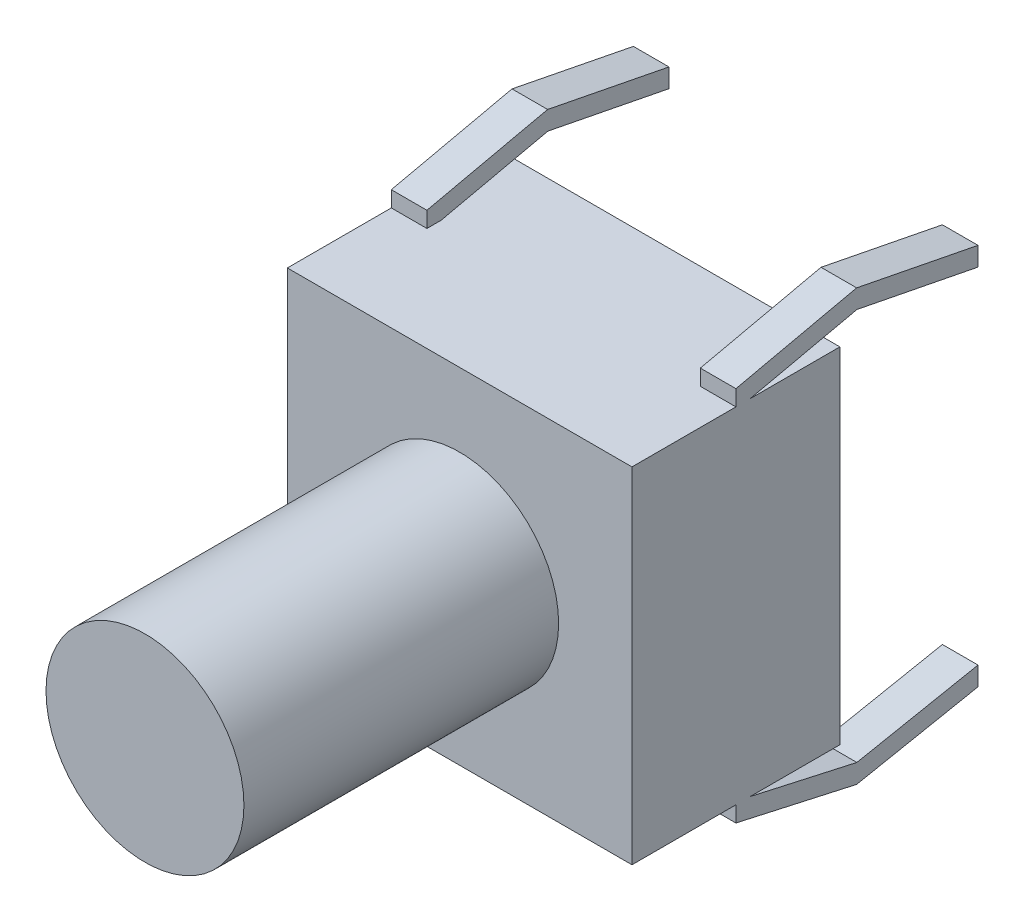
ISO-10303-21;
HEADER;
FILE_DESCRIPTION(('STEP AP214'),'2;1');
FILE_NAME('part.step','',(''),(''),'','','');
FILE_SCHEMA(('AUTOMOTIVE_DESIGN { 1 0 10303 214 1 1 1 1 }'));
ENDSEC;
DATA;
#1=APPLICATION_CONTEXT('core data for automotive mechanical design processes');
#2=APPLICATION_PROTOCOL_DEFINITION('international standard','automotive_design',2000,#1);
#3=PRODUCT_CONTEXT('',#1,'mechanical');
#4=PRODUCT('Part','Part','',(#3));
#5=PRODUCT_RELATED_PRODUCT_CATEGORY('part','',(#4));
#6=PRODUCT_DEFINITION_FORMATION('','',#4);
#7=PRODUCT_DEFINITION_CONTEXT('part definition',#1,'design');
#8=PRODUCT_DEFINITION('design','',#6,#7);
#9=PRODUCT_DEFINITION_SHAPE('','',#8);
#10=(LENGTH_UNIT() NAMED_UNIT(*) SI_UNIT(.MILLI.,.METRE.));
#11=(NAMED_UNIT(*) PLANE_ANGLE_UNIT() SI_UNIT($,.RADIAN.));
#12=(NAMED_UNIT(*) SI_UNIT($,.STERADIAN.) SOLID_ANGLE_UNIT());
#13=UNCERTAINTY_MEASURE_WITH_UNIT(LENGTH_MEASURE(1.E-05),#10,'distance_accuracy_value','');
#14=(GEOMETRIC_REPRESENTATION_CONTEXT(3) GLOBAL_UNCERTAINTY_ASSIGNED_CONTEXT((#13)) GLOBAL_UNIT_ASSIGNED_CONTEXT((#10,
#11,#12)) REPRESENTATION_CONTEXT('',''));
#15=CARTESIAN_POINT('',(0.,0.,0.));
#16=DIRECTION('',(0.,0.,1.));
#17=DIRECTION('',(1.,0.,0.));
#18=AXIS2_PLACEMENT_3D('',#15,#16,#17);
#19=CARTESIAN_POINT('',(-3.07339999999999,-3.0734,3.7084));
#20=DIRECTION('',(0.,1.,0.));
#21=DIRECTION('',(0.,0.,1.));
#22=AXIS2_PLACEMENT_3D('',#19,#20,#21);
#23=PLANE('',#22);
#24=DIRECTION('',(-1.,0.,0.));
#25=VECTOR('',#24,1.);
#26=CARTESIAN_POINT('',(-2.43839999999999,-3.0734,1.8542));
#27=LINE('',#26,#25);
#28=CARTESIAN_POINT('',(-2.43839999999999,-3.0734,1.8542));
#29=VERTEX_POINT('',#28);
#30=CARTESIAN_POINT('',(-3.07339999999999,-3.0734,1.8542));
#31=VERTEX_POINT('',#30);
#32=EDGE_CURVE('E58',#29,#31,#27,.T.);
#33=ORIENTED_EDGE('',*,*,#32,.F.);
#34=DIRECTION('',(0.,0.,1.));
#35=VECTOR('',#34,1.);
#36=CARTESIAN_POINT('',(-2.43839999999999,-3.0734,1.6002));
#37=LINE('',#36,#35);
#38=CARTESIAN_POINT('',(-2.43839999999999,-3.0734,1.6002));
#39=VERTEX_POINT('',#38);
#40=EDGE_CURVE('E63',#39,#29,#37,.T.);
#41=ORIENTED_EDGE('',*,*,#40,.F.);
#42=DIRECTION('',(-1.,0.,0.));
#43=VECTOR('',#42,1.);
#44=CARTESIAN_POINT('',(-2.43839999999999,-3.0734,1.6002));
#45=LINE('',#44,#43);
#46=CARTESIAN_POINT('',(-3.07339999999999,-3.0734,1.6002));
#47=VERTEX_POINT('',#46);
#48=EDGE_CURVE('E274',#39,#47,#45,.T.);
#49=ORIENTED_EDGE('',*,*,#48,.T.);
#50=DIRECTION('',(0.,0.,-1.));
#51=VECTOR('',#50,1.);
#52=CARTESIAN_POINT('',(-3.07339999999999,-3.0734,3.7084));
#53=LINE('',#52,#51);
#54=CARTESIAN_POINT('',(-3.07339999999999,-3.0734,0.));
#55=VERTEX_POINT('',#54);
#56=EDGE_CURVE('E584',#47,#55,#53,.T.);
#57=ORIENTED_EDGE('',*,*,#56,.T.);
#58=DIRECTION('',(1.,0.,0.));
#59=VECTOR('',#58,1.);
#60=CARTESIAN_POINT('',(-3.07339999999999,-3.0734,0.));
#61=LINE('',#60,#59);
#62=CARTESIAN_POINT('',(3.07340000000001,-3.0734,0.));
#63=VERTEX_POINT('',#62);
#64=EDGE_CURVE('E556',#55,#63,#61,.T.);
#65=ORIENTED_EDGE('',*,*,#64,.T.);
#66=DIRECTION('',(0.,0.,-1.));
#67=VECTOR('',#66,1.);
#68=CARTESIAN_POINT('',(3.07340000000001,-3.0734,3.7084));
#69=LINE('',#68,#67);
#70=CARTESIAN_POINT('',(3.07340000000001,-3.0734,1.6002));
#71=VERTEX_POINT('',#70);
#72=EDGE_CURVE('E565',#71,#63,#69,.T.);
#73=ORIENTED_EDGE('',*,*,#72,.F.);
#74=DIRECTION('',(1.,0.,0.));
#75=VECTOR('',#74,1.);
#76=CARTESIAN_POINT('',(2.43839999999999,-3.0734,1.6002));
#77=LINE('',#76,#75);
#78=CARTESIAN_POINT('',(2.43839999999999,-3.0734,1.6002));
#79=VERTEX_POINT('',#78);
#80=EDGE_CURVE('E380',#79,#71,#77,.T.);
#81=ORIENTED_EDGE('',*,*,#80,.F.);
#82=DIRECTION('',(0.,0.,1.));
#83=VECTOR('',#82,1.);
#84=CARTESIAN_POINT('',(2.43839999999999,-3.0734,1.6002));
#85=LINE('',#84,#83);
#86=CARTESIAN_POINT('',(2.43839999999999,-3.0734,1.8542));
#87=VERTEX_POINT('',#86);
#88=EDGE_CURVE('E329',#79,#87,#85,.T.);
#89=ORIENTED_EDGE('',*,*,#88,.T.);
#90=DIRECTION('',(1.,0.,0.));
#91=VECTOR('',#90,1.);
#92=CARTESIAN_POINT('',(2.43839999999999,-3.0734,1.8542));
#93=LINE('',#92,#91);
#94=CARTESIAN_POINT('',(3.07339999999999,-3.0734,1.8542));
#95=VERTEX_POINT('',#94);
#96=EDGE_CURVE('E358',#87,#95,#93,.T.);
#97=ORIENTED_EDGE('',*,*,#96,.T.);
#98=CARTESIAN_POINT('',(3.07340000000001,-3.0734,3.7084));
#99=VERTEX_POINT('',#98);
#100=EDGE_CURVE('E580',#99,#95,#69,.T.);
#101=ORIENTED_EDGE('',*,*,#100,.F.);
#102=DIRECTION('',(1.,0.,0.));
#103=VECTOR('',#102,1.);
#104=CARTESIAN_POINT('',(-3.07339999999999,-3.0734,3.7084));
#105=LINE('',#104,#103);
#106=CARTESIAN_POINT('',(-3.07339999999999,-3.0734,3.7084));
#107=VERTEX_POINT('',#106);
#108=EDGE_CURVE('E562',#107,#99,#105,.T.);
#109=ORIENTED_EDGE('',*,*,#108,.F.);
#110=EDGE_CURVE('E585',#107,#31,#53,.T.);
#111=ORIENTED_EDGE('',*,*,#110,.T.);
#112=EDGE_LOOP('',(#33,#41,#49,#57,#65,#73,#81,#89,#97,#101,#109,#111));
#113=FACE_BOUND('',#112,.T.);
#114=ADVANCED_FACE('F41',(#113),#23,.F.);
#115=CARTESIAN_POINT('',(-3.07339999999999,3.0734,3.7084));
#116=DIRECTION('',(0.,-1.,0.));
#117=DIRECTION('',(0.,0.,-1.));
#118=AXIS2_PLACEMENT_3D('',#115,#116,#117);
#119=PLANE('',#118);
#120=DIRECTION('',(1.,0.,0.));
#121=VECTOR('',#120,1.);
#122=CARTESIAN_POINT('',(2.43839999999999,3.0734,1.8542));
#123=LINE('',#122,#121);
#124=CARTESIAN_POINT('',(2.43839999999999,3.0734,1.8542));
#125=VERTEX_POINT('',#124);
#126=CARTESIAN_POINT('',(3.07340000000001,3.0734,1.8542));
#127=VERTEX_POINT('',#126);
#128=EDGE_CURVE('E445',#125,#127,#123,.T.);
#129=ORIENTED_EDGE('',*,*,#128,.F.);
#130=DIRECTION('',(0.,0.,1.));
#131=VECTOR('',#130,1.);
#132=CARTESIAN_POINT('',(2.43839999999999,3.0734,1.6002));
#133=LINE('',#132,#131);
#134=CARTESIAN_POINT('',(2.43839999999999,3.0734,1.6002));
#135=VERTEX_POINT('',#134);
#136=EDGE_CURVE('E403',#135,#125,#133,.T.);
#137=ORIENTED_EDGE('',*,*,#136,.F.);
#138=DIRECTION('',(1.,0.,0.));
#139=VECTOR('',#138,1.);
#140=CARTESIAN_POINT('',(2.43839999999999,3.0734,1.6002));
#141=LINE('',#140,#139);
#142=CARTESIAN_POINT('',(3.07339999999999,3.0734,1.6002));
#143=VERTEX_POINT('',#142);
#144=EDGE_CURVE('E427',#135,#143,#141,.T.);
#145=ORIENTED_EDGE('',*,*,#144,.T.);
#146=DIRECTION('',(0.,0.,-1.));
#147=VECTOR('',#146,1.);
#148=CARTESIAN_POINT('',(3.07340000000001,3.0734,3.7084));
#149=LINE('',#148,#147);
#150=CARTESIAN_POINT('',(3.07340000000001,3.0734,0.));
#151=VERTEX_POINT('',#150);
#152=EDGE_CURVE('E591',#143,#151,#149,.T.);
#153=ORIENTED_EDGE('',*,*,#152,.T.);
#154=DIRECTION('',(-1.,0.,0.));
#155=VECTOR('',#154,1.);
#156=CARTESIAN_POINT('',(-3.07339999999999,3.0734,0.));
#157=LINE('',#156,#155);
#158=CARTESIAN_POINT('',(-3.07339999999999,3.0734,0.));
#159=VERTEX_POINT('',#158);
#160=EDGE_CURVE('E569',#151,#159,#157,.T.);
#161=ORIENTED_EDGE('',*,*,#160,.T.);
#162=DIRECTION('',(0.,0.,-1.));
#163=VECTOR('',#162,1.);
#164=CARTESIAN_POINT('',(-3.07339999999999,3.0734,3.7084));
#165=LINE('',#164,#163);
#166=CARTESIAN_POINT('',(-3.07339999999999,3.0734,1.6002));
#167=VERTEX_POINT('',#166);
#168=EDGE_CURVE('E587',#167,#159,#165,.T.);
#169=ORIENTED_EDGE('',*,*,#168,.F.);
#170=DIRECTION('',(-1.,0.,0.));
#171=VECTOR('',#170,1.);
#172=CARTESIAN_POINT('',(-2.43839999999999,3.0734,1.6002));
#173=LINE('',#172,#171);
#174=CARTESIAN_POINT('',(-2.43839999999999,3.0734,1.6002));
#175=VERTEX_POINT('',#174);
#176=EDGE_CURVE('E524',#175,#167,#173,.T.);
#177=ORIENTED_EDGE('',*,*,#176,.F.);
#178=DIRECTION('',(0.,0.,1.));
#179=VECTOR('',#178,1.);
#180=CARTESIAN_POINT('',(-2.43839999999999,3.0734,1.6002));
#181=LINE('',#180,#179);
#182=CARTESIAN_POINT('',(-2.43839999999999,3.0734,1.8542));
#183=VERTEX_POINT('',#182);
#184=EDGE_CURVE('E473',#175,#183,#181,.T.);
#185=ORIENTED_EDGE('',*,*,#184,.T.);
#186=DIRECTION('',(-1.,0.,0.));
#187=VECTOR('',#186,1.);
#188=CARTESIAN_POINT('',(-2.43839999999999,3.0734,1.8542));
#189=LINE('',#188,#187);
#190=CARTESIAN_POINT('',(-3.07339999999999,3.0734,1.8542));
#191=VERTEX_POINT('',#190);
#192=EDGE_CURVE('E502',#183,#191,#189,.T.);
#193=ORIENTED_EDGE('',*,*,#192,.T.);
#194=CARTESIAN_POINT('',(-3.07339999999999,3.0734,3.7084));
#195=VERTEX_POINT('',#194);
#196=EDGE_CURVE('E588',#195,#191,#165,.T.);
#197=ORIENTED_EDGE('',*,*,#196,.F.);
#198=DIRECTION('',(-1.,0.,0.));
#199=VECTOR('',#198,1.);
#200=CARTESIAN_POINT('',(-3.07339999999999,3.0734,3.7084));
#201=LINE('',#200,#199);
#202=CARTESIAN_POINT('',(3.07340000000001,3.0734,3.7084));
#203=VERTEX_POINT('',#202);
#204=EDGE_CURVE('E555',#203,#195,#201,.T.);
#205=ORIENTED_EDGE('',*,*,#204,.F.);
#206=EDGE_CURVE('E45',#203,#127,#149,.T.);
#207=ORIENTED_EDGE('',*,*,#206,.T.);
#208=EDGE_LOOP('',(#129,#137,#145,#153,#161,#169,#177,#185,#193,#197,#205,#207));
#209=FACE_BOUND('',#208,.T.);
#210=ADVANCED_FACE('F605',(#209),#119,.F.);
#211=CARTESIAN_POINT('',(3.07340000000001,-3.0734,3.7084));
#212=DIRECTION('',(-1.,0.,0.));
#213=DIRECTION('',(0.,0.,1.));
#214=AXIS2_PLACEMENT_3D('',#211,#212,#213);
#215=PLANE('',#214);
#216=DIRECTION('',(0.,1.,0.));
#217=VECTOR('',#216,1.);
#218=CARTESIAN_POINT('',(3.07340000000001,-3.0734,0.));
#219=LINE('',#218,#217);
#220=EDGE_CURVE('E549',#63,#151,#219,.T.);
#221=ORIENTED_EDGE('',*,*,#220,.T.);
#222=ORIENTED_EDGE('',*,*,#152,.F.);
#223=DIRECTION('',(0.,-0.217728161041355,0.976009450717333));
#224=VECTOR('',#223,1.);
#225=CARTESIAN_POINT('',(3.07339999999999,3.49803981995083,-0.303331795982005));
#226=LINE('',#225,#224);
#227=CARTESIAN_POINT('',(3.07339999999999,3.49803981995083,-0.303331795982005));
#228=VERTEX_POINT('',#227);
#229=EDGE_CURVE('E384',#228,#143,#226,.T.);
#230=ORIENTED_EDGE('',*,*,#229,.F.);
#231=DIRECTION('',(0.,0.192859935265024,0.981226296717312));
#232=VECTOR('',#231,1.);
#233=CARTESIAN_POINT('',(3.07339999999999,3.0734,-2.4638));
#234=LINE('',#233,#232);
#235=CARTESIAN_POINT('',(3.07339999999999,3.0734,-2.4638));
#236=VERTEX_POINT('',#235);
#237=EDGE_CURVE('E431',#236,#228,#234,.T.);
#238=ORIENTED_EDGE('',*,*,#237,.F.);
#239=DIRECTION('',(0.,-1.,0.));
#240=VECTOR('',#239,1.);
#241=CARTESIAN_POINT('',(3.07339999999999,3.40991768313251,-2.4638));
#242=LINE('',#241,#240);
#243=CARTESIAN_POINT('',(3.07339999999999,3.40991768313251,-2.4638));
#244=VERTEX_POINT('',#243);
#245=EDGE_CURVE('E434',#244,#236,#242,.T.);
#246=ORIENTED_EDGE('',*,*,#245,.F.);
#247=DIRECTION('',(0.,-0.192859935265024,-0.981226296717312));
#248=VECTOR('',#247,1.);
#249=CARTESIAN_POINT('',(3.07339999999999,3.8354,-0.299045368485264));
#250=LINE('',#249,#248);
#251=CARTESIAN_POINT('',(3.07339999999999,3.8354,-0.299045368485264));
#252=VERTEX_POINT('',#251);
#253=EDGE_CURVE('E437',#252,#244,#250,.T.);
#254=ORIENTED_EDGE('',*,*,#253,.F.);
#255=DIRECTION('',(0.,0.217728161041356,-0.976009450717333));
#256=VECTOR('',#255,1.);
#257=CARTESIAN_POINT('',(3.07339999999999,3.35505408326063,1.8542));
#258=LINE('',#257,#256);
#259=CARTESIAN_POINT('',(3.07339999999999,3.35505408326063,1.8542));
#260=VERTEX_POINT('',#259);
#261=EDGE_CURVE('E440',#260,#252,#258,.T.);
#262=ORIENTED_EDGE('',*,*,#261,.F.);
#263=DIRECTION('',(0.,1.,0.));
#264=VECTOR('',#263,1.);
#265=CARTESIAN_POINT('',(3.07339999999999,3.0734,1.8542));
#266=LINE('',#265,#264);
#267=EDGE_CURVE('E408',#127,#260,#266,.T.);
#268=ORIENTED_EDGE('',*,*,#267,.F.);
#269=ORIENTED_EDGE('',*,*,#206,.F.);
#270=DIRECTION('',(0.,1.,0.));
#271=VECTOR('',#270,1.);
#272=CARTESIAN_POINT('',(3.07340000000001,-3.0734,3.7084));
#273=LINE('',#272,#271);
#274=EDGE_CURVE('E551',#99,#203,#273,.T.);
#275=ORIENTED_EDGE('',*,*,#274,.F.);
#276=ORIENTED_EDGE('',*,*,#100,.T.);
#277=DIRECTION('',(0.,-1.,0.));
#278=VECTOR('',#277,1.);
#279=CARTESIAN_POINT('',(3.07339999999999,-3.0734,1.8542));
#280=LINE('',#279,#278);
#281=CARTESIAN_POINT('',(3.07339999999999,-3.35505408326063,1.8542));
#282=VERTEX_POINT('',#281);
#283=EDGE_CURVE('E312',#95,#282,#280,.T.);
#284=ORIENTED_EDGE('',*,*,#283,.T.);
#285=DIRECTION('',(0.,-0.217728161041356,-0.976009450717333));
#286=VECTOR('',#285,1.);
#287=CARTESIAN_POINT('',(3.07339999999999,-3.35505408326063,1.8542));
#288=LINE('',#287,#286);
#289=CARTESIAN_POINT('',(3.07339999999999,-3.8354,-0.299045368485264));
#290=VERTEX_POINT('',#289);
#291=EDGE_CURVE('E362',#282,#290,#288,.T.);
#292=ORIENTED_EDGE('',*,*,#291,.T.);
#293=DIRECTION('',(0.,0.192859935265024,-0.981226296717312));
#294=VECTOR('',#293,1.);
#295=CARTESIAN_POINT('',(3.07339999999999,-3.8354,-0.299045368485264));
#296=LINE('',#295,#294);
#297=CARTESIAN_POINT('',(3.07339999999999,-3.40991768313251,-2.4638));
#298=VERTEX_POINT('',#297);
#299=EDGE_CURVE('E366',#290,#298,#296,.T.);
#300=ORIENTED_EDGE('',*,*,#299,.T.);
#301=DIRECTION('',(0.,1.,0.));
#302=VECTOR('',#301,1.);
#303=CARTESIAN_POINT('',(3.07339999999999,-3.40991768313251,-2.4638));
#304=LINE('',#303,#302);
#305=CARTESIAN_POINT('',(3.07339999999999,-3.0734,-2.4638));
#306=VERTEX_POINT('',#305);
#307=EDGE_CURVE('E370',#298,#306,#304,.T.);
#308=ORIENTED_EDGE('',*,*,#307,.T.);
#309=DIRECTION('',(0.,-0.192859935265024,0.981226296717312));
#310=VECTOR('',#309,1.);
#311=CARTESIAN_POINT('',(3.07339999999999,-3.0734,-2.4638));
#312=LINE('',#311,#310);
#313=CARTESIAN_POINT('',(3.07339999999999,-3.49803981995083,-0.303331795982005));
#314=VERTEX_POINT('',#313);
#315=EDGE_CURVE('E374',#306,#314,#312,.T.);
#316=ORIENTED_EDGE('',*,*,#315,.T.);
#317=DIRECTION('',(0.,0.217728161041355,0.976009450717333));
#318=VECTOR('',#317,1.);
#319=CARTESIAN_POINT('',(3.07339999999999,-3.49803981995083,-0.303331795982005));
#320=LINE('',#319,#318);
#321=EDGE_CURVE('E334',#314,#71,#320,.T.);
#322=ORIENTED_EDGE('',*,*,#321,.T.);
#323=ORIENTED_EDGE('',*,*,#72,.T.);
#324=EDGE_LOOP('',(#221,#222,#230,#238,#246,#254,#262,#268,#269,#275,#276,#284,#292,#300,#308,
#316,#322,#323));
#325=FACE_BOUND('',#324,.T.);
#326=ADVANCED_FACE('F43',(#325),#215,.F.);
#327=CARTESIAN_POINT('',(-3.07339999999999,-3.0734,3.7084));
#328=DIRECTION('',(1.,0.,0.));
#329=DIRECTION('',(0.,0.,-1.));
#330=AXIS2_PLACEMENT_3D('',#327,#328,#329);
#331=PLANE('',#330);
#332=DIRECTION('',(0.,-1.,0.));
#333=VECTOR('',#332,1.);
#334=CARTESIAN_POINT('',(-3.07339999999999,-3.0734,0.));
#335=LINE('',#334,#333);
#336=EDGE_CURVE('E573',#159,#55,#335,.T.);
#337=ORIENTED_EDGE('',*,*,#336,.T.);
#338=ORIENTED_EDGE('',*,*,#56,.F.);
#339=DIRECTION('',(0.,0.217728161041355,0.976009450717333));
#340=VECTOR('',#339,1.);
#341=CARTESIAN_POINT('',(-3.07339999999999,-3.49803981995083,-0.303331795982005));
#342=LINE('',#341,#340);
#343=CARTESIAN_POINT('',(-3.07339999999999,-3.49803981995083,-0.303331795982005));
#344=VERTEX_POINT('',#343);
#345=EDGE_CURVE('E294',#344,#47,#342,.T.);
#346=ORIENTED_EDGE('',*,*,#345,.F.);
#347=DIRECTION('',(0.,-0.192859935265024,0.981226296717312));
#348=VECTOR('',#347,1.);
#349=CARTESIAN_POINT('',(-3.07339999999999,-3.0734,-2.4638));
#350=LINE('',#349,#348);
#351=CARTESIAN_POINT('',(-3.07339999999999,-3.0734,-2.4638));
#352=VERTEX_POINT('',#351);
#353=EDGE_CURVE('E268',#352,#344,#350,.T.);
#354=ORIENTED_EDGE('',*,*,#353,.F.);
#355=DIRECTION('',(0.,1.,0.));
#356=VECTOR('',#355,1.);
#357=CARTESIAN_POINT('',(-3.07339999999999,-3.40991768313251,-2.4638));
#358=LINE('',#357,#356);
#359=CARTESIAN_POINT('',(-3.07339999999999,-3.40991768313251,-2.4638));
#360=VERTEX_POINT('',#359);
#361=EDGE_CURVE('E299',#360,#352,#358,.T.);
#362=ORIENTED_EDGE('',*,*,#361,.F.);
#363=DIRECTION('',(0.,0.192859935265024,-0.981226296717312));
#364=VECTOR('',#363,1.);
#365=CARTESIAN_POINT('',(-3.07339999999999,-3.8354,-0.299045368485264));
#366=LINE('',#365,#364);
#367=CARTESIAN_POINT('',(-3.07339999999999,-3.8354,-0.299045368485264));
#368=VERTEX_POINT('',#367);
#369=EDGE_CURVE('E302',#368,#360,#366,.T.);
#370=ORIENTED_EDGE('',*,*,#369,.F.);
#371=DIRECTION('',(0.,-0.217728161041356,-0.976009450717333));
#372=VECTOR('',#371,1.);
#373=CARTESIAN_POINT('',(-3.07339999999999,-3.35505408326063,1.8542));
#374=LINE('',#373,#372);
#375=CARTESIAN_POINT('',(-3.07339999999999,-3.35505408326063,1.8542));
#376=VERTEX_POINT('',#375);
#377=EDGE_CURVE('E305',#376,#368,#374,.T.);
#378=ORIENTED_EDGE('',*,*,#377,.F.);
#379=DIRECTION('',(0.,-1.,0.));
#380=VECTOR('',#379,1.);
#381=CARTESIAN_POINT('',(-3.07339999999999,-3.0734,1.8542));
#382=LINE('',#381,#380);
#383=EDGE_CURVE('E280',#31,#376,#382,.T.);
#384=ORIENTED_EDGE('',*,*,#383,.F.);
#385=ORIENTED_EDGE('',*,*,#110,.F.);
#386=DIRECTION('',(0.,-1.,0.));
#387=VECTOR('',#386,1.);
#388=CARTESIAN_POINT('',(-3.07339999999999,-3.0734,3.7084));
#389=LINE('',#388,#387);
#390=EDGE_CURVE('E559',#195,#107,#389,.T.);
#391=ORIENTED_EDGE('',*,*,#390,.F.);
#392=ORIENTED_EDGE('',*,*,#196,.T.);
#393=DIRECTION('',(0.,1.,0.));
#394=VECTOR('',#393,1.);
#395=CARTESIAN_POINT('',(-3.07339999999999,3.0734,1.8542));
#396=LINE('',#395,#394);
#397=CARTESIAN_POINT('',(-3.07339999999999,3.35505408326063,1.8542));
#398=VERTEX_POINT('',#397);
#399=EDGE_CURVE('E449',#191,#398,#396,.T.);
#400=ORIENTED_EDGE('',*,*,#399,.T.);
#401=DIRECTION('',(0.,0.217728161041356,-0.976009450717333));
#402=VECTOR('',#401,1.);
#403=CARTESIAN_POINT('',(-3.07339999999999,3.35505408326063,1.8542));
#404=LINE('',#403,#402);
#405=CARTESIAN_POINT('',(-3.07339999999999,3.8354,-0.299045368485264));
#406=VERTEX_POINT('',#405);
#407=EDGE_CURVE('E506',#398,#406,#404,.T.);
#408=ORIENTED_EDGE('',*,*,#407,.T.);
#409=DIRECTION('',(0.,-0.192859935265024,-0.981226296717312));
#410=VECTOR('',#409,1.);
#411=CARTESIAN_POINT('',(-3.07339999999999,3.8354,-0.299045368485264));
#412=LINE('',#411,#410);
#413=CARTESIAN_POINT('',(-3.07339999999999,3.40991768313251,-2.4638));
#414=VERTEX_POINT('',#413);
#415=EDGE_CURVE('E510',#406,#414,#412,.T.);
#416=ORIENTED_EDGE('',*,*,#415,.T.);
#417=DIRECTION('',(0.,-1.,0.));
#418=VECTOR('',#417,1.);
#419=CARTESIAN_POINT('',(-3.07339999999999,3.40991768313251,-2.4638));
#420=LINE('',#419,#418);
#421=CARTESIAN_POINT('',(-3.07339999999999,3.0734,-2.4638));
#422=VERTEX_POINT('',#421);
#423=EDGE_CURVE('E514',#414,#422,#420,.T.);
#424=ORIENTED_EDGE('',*,*,#423,.T.);
#425=DIRECTION('',(0.,0.192859935265024,0.981226296717312));
#426=VECTOR('',#425,1.);
#427=CARTESIAN_POINT('',(-3.07339999999999,3.0734,-2.4638));
#428=LINE('',#427,#426);
#429=CARTESIAN_POINT('',(-3.07339999999999,3.49803981995083,-0.303331795982005));
#430=VERTEX_POINT('',#429);
#431=EDGE_CURVE('E518',#422,#430,#428,.T.);
#432=ORIENTED_EDGE('',*,*,#431,.T.);
#433=DIRECTION('',(0.,-0.217728161041355,0.976009450717333));
#434=VECTOR('',#433,1.);
#435=CARTESIAN_POINT('',(-3.07339999999999,3.49803981995083,-0.303331795982005));
#436=LINE('',#435,#434);
#437=EDGE_CURVE('E478',#430,#167,#436,.T.);
#438=ORIENTED_EDGE('',*,*,#437,.T.);
#439=ORIENTED_EDGE('',*,*,#168,.T.);
#440=EDGE_LOOP('',(#337,#338,#346,#354,#362,#370,#378,#384,#385,#391,#392,#400,#408,#416,#424,
#432,#438,#439));
#441=FACE_BOUND('',#440,.T.);
#442=ADVANCED_FACE('F598',(#441),#331,.F.);
#443=CARTESIAN_POINT('',(0.,0.,3.7084));
#444=DIRECTION('',(0.,0.,-1.));
#445=DIRECTION('',(-1.,0.,0.));
#446=AXIS2_PLACEMENT_3D('',#443,#444,#445);
#447=PLANE('',#446);
#448=CARTESIAN_POINT('',(0.,0.,3.7084));
#449=DIRECTION('',(0.,0.,1.));
#450=DIRECTION('',(1.,0.,0.));
#451=AXIS2_PLACEMENT_3D('',#448,#449,#450);
#452=CIRCLE('',#451,1.7653);
#453=CARTESIAN_POINT('',(1.7653,0.,3.7084));
#454=VERTEX_POINT('',#453);
#455=EDGE_CURVE('E11',#454,#454,#452,.T.);
#456=ORIENTED_EDGE('',*,*,#455,.F.);
#457=EDGE_LOOP('',(#456));
#458=FACE_BOUND('',#457,.T.);
#459=ORIENTED_EDGE('',*,*,#274,.T.);
#460=ORIENTED_EDGE('',*,*,#204,.T.);
#461=ORIENTED_EDGE('',*,*,#390,.T.);
#462=ORIENTED_EDGE('',*,*,#108,.T.);
#463=EDGE_LOOP('',(#459,#460,#461,#462));
#464=FACE_BOUND('',#463,.T.);
#465=ADVANCED_FACE('F635',(#458,#464),#447,.F.);
#466=CARTESIAN_POINT('',(0.,0.,0.));
#467=DIRECTION('',(0.,0.,-1.));
#468=DIRECTION('',(-1.,0.,0.));
#469=AXIS2_PLACEMENT_3D('',#466,#467,#468);
#470=PLANE('',#469);
#471=ORIENTED_EDGE('',*,*,#220,.F.);
#472=ORIENTED_EDGE('',*,*,#64,.F.);
#473=ORIENTED_EDGE('',*,*,#336,.F.);
#474=ORIENTED_EDGE('',*,*,#160,.F.);
#475=EDGE_LOOP('',(#471,#472,#473,#474));
#476=FACE_BOUND('',#475,.T.);
#477=ADVANCED_FACE('F608',(#476),#470,.T.);
#478=CARTESIAN_POINT('',(0.,0.,9.3218));
#479=DIRECTION('',(0.,0.,-1.));
#480=DIRECTION('',(-1.,0.,0.));
#481=AXIS2_PLACEMENT_3D('',#478,#479,#480);
#482=CYLINDRICAL_SURFACE('',#481,1.7653);
#483=CARTESIAN_POINT('',(0.,0.,9.3218));
#484=DIRECTION('',(0.,0.,1.));
#485=DIRECTION('',(1.,0.,0.));
#486=AXIS2_PLACEMENT_3D('',#483,#484,#485);
#487=CIRCLE('',#486,1.7653);
#488=CARTESIAN_POINT('',(1.7653,0.,9.3218));
#489=VERTEX_POINT('',#488);
#490=EDGE_CURVE('E528',#489,#489,#487,.T.);
#491=ORIENTED_EDGE('',*,*,#490,.F.);
#492=EDGE_LOOP('',(#491));
#493=FACE_BOUND('',#492,.T.);
#494=ORIENTED_EDGE('',*,*,#455,.T.);
#495=EDGE_LOOP('',(#494));
#496=FACE_BOUND('',#495,.T.);
#497=ADVANCED_FACE('F912',(#493,#496),#482,.T.);
#498=CARTESIAN_POINT('',(0.,0.,9.3218));
#499=DIRECTION('',(0.,0.,1.));
#500=DIRECTION('',(1.,0.,0.));
#501=AXIS2_PLACEMENT_3D('',#498,#499,#500);
#502=PLANE('',#501);
#503=ORIENTED_EDGE('',*,*,#490,.T.);
#504=EDGE_LOOP('',(#503));
#505=FACE_BOUND('',#504,.T.);
#506=ADVANCED_FACE('F890',(#505),#502,.T.);
#507=CARTESIAN_POINT('',(-2.43839999999999,3.49803981995083,-0.303331795982005));
#508=DIRECTION('',(0.,-0.976009450717333,-0.217728161041355));
#509=DIRECTION('',(0.,0.217728161041355,-0.976009450717333));
#510=AXIS2_PLACEMENT_3D('',#507,#508,#509);
#511=PLANE('',#510);
#512=ORIENTED_EDGE('',*,*,#437,.F.);
#513=DIRECTION('',(-1.,0.,0.));
#514=VECTOR('',#513,1.);
#515=CARTESIAN_POINT('',(-2.43839999999999,3.49803981995083,-0.303331795982005));
#516=LINE('',#515,#514);
#517=CARTESIAN_POINT('',(-2.43839999999999,3.49803981995083,-0.303331795982005));
#518=VERTEX_POINT('',#517);
#519=EDGE_CURVE('E529',#518,#430,#516,.T.);
#520=ORIENTED_EDGE('',*,*,#519,.F.);
#521=DIRECTION('',(0.,-0.217728161041355,0.976009450717333));
#522=VECTOR('',#521,1.);
#523=CARTESIAN_POINT('',(-2.43839999999999,3.49803981995083,-0.303331795982005));
#524=LINE('',#523,#522);
#525=EDGE_CURVE('E498',#518,#175,#524,.T.);
#526=ORIENTED_EDGE('',*,*,#525,.T.);
#527=ORIENTED_EDGE('',*,*,#176,.T.);
#528=EDGE_LOOP('',(#512,#520,#526,#527));
#529=FACE_BOUND('',#528,.T.);
#530=ADVANCED_FACE('F886',(#529),#511,.T.);
#531=CARTESIAN_POINT('',(-2.43839999999999,3.0734,-2.4638));
#532=DIRECTION('',(0.,-0.981226296717312,0.192859935265024));
#533=DIRECTION('',(0.,-0.192859935265024,-0.981226296717312));
#534=AXIS2_PLACEMENT_3D('',#531,#532,#533);
#535=PLANE('',#534);
#536=ORIENTED_EDGE('',*,*,#431,.F.);
#537=DIRECTION('',(-1.,0.,0.));
#538=VECTOR('',#537,1.);
#539=CARTESIAN_POINT('',(-2.43839999999999,3.0734,-2.4638));
#540=LINE('',#539,#538);
#541=CARTESIAN_POINT('',(-2.43839999999999,3.0734,-2.4638));
#542=VERTEX_POINT('',#541);
#543=EDGE_CURVE('E532',#542,#422,#540,.T.);
#544=ORIENTED_EDGE('',*,*,#543,.F.);
#545=DIRECTION('',(0.,0.192859935265024,0.981226296717312));
#546=VECTOR('',#545,1.);
#547=CARTESIAN_POINT('',(-2.43839999999999,3.0734,-2.4638));
#548=LINE('',#547,#546);
#549=EDGE_CURVE('E494',#542,#518,#548,.T.);
#550=ORIENTED_EDGE('',*,*,#549,.T.);
#551=ORIENTED_EDGE('',*,*,#519,.T.);
#552=EDGE_LOOP('',(#536,#544,#550,#551));
#553=FACE_BOUND('',#552,.T.);
#554=ADVANCED_FACE('F889',(#553),#535,.T.);
#555=CARTESIAN_POINT('',(-2.43839999999999,3.40991768313251,-2.4638));
#556=DIRECTION('',(0.,0.,-1.));
#557=DIRECTION('',(-1.,0.,0.));
#558=AXIS2_PLACEMENT_3D('',#555,#556,#557);
#559=PLANE('',#558);
#560=ORIENTED_EDGE('',*,*,#423,.F.);
#561=DIRECTION('',(-1.,0.,0.));
#562=VECTOR('',#561,1.);
#563=CARTESIAN_POINT('',(-2.43839999999999,3.40991768313251,-2.4638));
#564=LINE('',#563,#562);
#565=CARTESIAN_POINT('',(-2.43839999999999,3.40991768313251,-2.4638));
#566=VERTEX_POINT('',#565);
#567=EDGE_CURVE('E535',#566,#414,#564,.T.);
#568=ORIENTED_EDGE('',*,*,#567,.F.);
#569=DIRECTION('',(0.,-1.,0.));
#570=VECTOR('',#569,1.);
#571=CARTESIAN_POINT('',(-2.43839999999999,3.40991768313251,-2.4638));
#572=LINE('',#571,#570);
#573=EDGE_CURVE('E490',#566,#542,#572,.T.);
#574=ORIENTED_EDGE('',*,*,#573,.T.);
#575=ORIENTED_EDGE('',*,*,#543,.T.);
#576=EDGE_LOOP('',(#560,#568,#574,#575));
#577=FACE_BOUND('',#576,.T.);
#578=ADVANCED_FACE('F894',(#577),#559,.T.);
#579=CARTESIAN_POINT('',(-2.43839999999999,3.8354,-0.299045368485264));
#580=DIRECTION('',(0.,0.981226296717312,-0.192859935265024));
#581=DIRECTION('',(0.,0.192859935265024,0.981226296717312));
#582=AXIS2_PLACEMENT_3D('',#579,#580,#581);
#583=PLANE('',#582);
#584=ORIENTED_EDGE('',*,*,#415,.F.);
#585=DIRECTION('',(-1.,0.,0.));
#586=VECTOR('',#585,1.);
#587=CARTESIAN_POINT('',(-2.43839999999999,3.8354,-0.299045368485264));
#588=LINE('',#587,#586);
#589=CARTESIAN_POINT('',(-2.43839999999999,3.8354,-0.299045368485264));
#590=VERTEX_POINT('',#589);
#591=EDGE_CURVE('E538',#590,#406,#588,.T.);
#592=ORIENTED_EDGE('',*,*,#591,.F.);
#593=DIRECTION('',(0.,-0.192859935265024,-0.981226296717312));
#594=VECTOR('',#593,1.);
#595=CARTESIAN_POINT('',(-2.43839999999999,3.8354,-0.299045368485264));
#596=LINE('',#595,#594);
#597=EDGE_CURVE('E486',#590,#566,#596,.T.);
#598=ORIENTED_EDGE('',*,*,#597,.T.);
#599=ORIENTED_EDGE('',*,*,#567,.T.);
#600=EDGE_LOOP('',(#584,#592,#598,#599));
#601=FACE_BOUND('',#600,.T.);
#602=ADVANCED_FACE('F898',(#601),#583,.T.);
#603=CARTESIAN_POINT('',(-2.43839999999999,3.35505408326063,1.8542));
#604=DIRECTION('',(0.,0.976009450717333,0.217728161041355));
#605=DIRECTION('',(0.,-0.217728161041356,0.976009450717333));
#606=AXIS2_PLACEMENT_3D('',#603,#604,#605);
#607=PLANE('',#606);
#608=ORIENTED_EDGE('',*,*,#407,.F.);
#609=DIRECTION('',(-1.,0.,0.));
#610=VECTOR('',#609,1.);
#611=CARTESIAN_POINT('',(-2.43839999999999,3.35505408326063,1.8542));
#612=LINE('',#611,#610);
#613=CARTESIAN_POINT('',(-2.43839999999999,3.35505408326063,1.8542));
#614=VERTEX_POINT('',#613);
#615=EDGE_CURVE('E541',#614,#398,#612,.T.);
#616=ORIENTED_EDGE('',*,*,#615,.F.);
#617=DIRECTION('',(0.,0.217728161041356,-0.976009450717333));
#618=VECTOR('',#617,1.);
#619=CARTESIAN_POINT('',(-2.43839999999999,3.35505408326063,1.8542));
#620=LINE('',#619,#618);
#621=EDGE_CURVE('E482',#614,#590,#620,.T.);
#622=ORIENTED_EDGE('',*,*,#621,.T.);
#623=ORIENTED_EDGE('',*,*,#591,.T.);
#624=EDGE_LOOP('',(#608,#616,#622,#623));
#625=FACE_BOUND('',#624,.T.);
#626=ADVANCED_FACE('F902',(#625),#607,.T.);
#627=CARTESIAN_POINT('',(-2.43839999999999,3.0734,1.8542));
#628=DIRECTION('',(0.,0.,1.));
#629=DIRECTION('',(1.,0.,0.));
#630=AXIS2_PLACEMENT_3D('',#627,#628,#629);
#631=PLANE('',#630);
#632=ORIENTED_EDGE('',*,*,#399,.F.);
#633=ORIENTED_EDGE('',*,*,#192,.F.);
#634=DIRECTION('',(0.,1.,0.));
#635=VECTOR('',#634,1.);
#636=CARTESIAN_POINT('',(-2.43839999999999,3.0734,1.8542));
#637=LINE('',#636,#635);
#638=EDGE_CURVE('E477',#183,#614,#637,.T.);
#639=ORIENTED_EDGE('',*,*,#638,.T.);
#640=ORIENTED_EDGE('',*,*,#615,.T.);
#641=EDGE_LOOP('',(#632,#633,#639,#640));
#642=FACE_BOUND('',#641,.T.);
#643=ADVANCED_FACE('F884',(#642),#631,.T.);
#644=CARTESIAN_POINT('',(-2.43839999999999,0.,0.));
#645=DIRECTION('',(-1.,0.,0.));
#646=DIRECTION('',(0.,0.,1.));
#647=AXIS2_PLACEMENT_3D('',#644,#645,#646);
#648=PLANE('',#647);
#649=ORIENTED_EDGE('',*,*,#184,.F.);
#650=ORIENTED_EDGE('',*,*,#525,.F.);
#651=ORIENTED_EDGE('',*,*,#549,.F.);
#652=ORIENTED_EDGE('',*,*,#573,.F.);
#653=ORIENTED_EDGE('',*,*,#597,.F.);
#654=ORIENTED_EDGE('',*,*,#621,.F.);
#655=ORIENTED_EDGE('',*,*,#638,.F.);
#656=EDGE_LOOP('',(#649,#650,#651,#652,#653,#654,#655));
#657=FACE_BOUND('',#656,.T.);
#658=ADVANCED_FACE('F688',(#657),#648,.F.);
#659=CARTESIAN_POINT('',(2.43839999999999,3.0734,1.8542));
#660=DIRECTION('',(0.,0.,-1.));
#661=DIRECTION('',(-1.,0.,0.));
#662=AXIS2_PLACEMENT_3D('',#659,#660,#661);
#663=PLANE('',#662);
#664=ORIENTED_EDGE('',*,*,#267,.T.);
#665=DIRECTION('',(1.,0.,0.));
#666=VECTOR('',#665,1.);
#667=CARTESIAN_POINT('',(2.43839999999999,3.35505408326063,1.8542));
#668=LINE('',#667,#666);
#669=CARTESIAN_POINT('',(2.43839999999999,3.35505408326063,1.8542));
#670=VERTEX_POINT('',#669);
#671=EDGE_CURVE('E450',#670,#260,#668,.T.);
#672=ORIENTED_EDGE('',*,*,#671,.F.);
#673=DIRECTION('',(0.,1.,0.));
#674=VECTOR('',#673,1.);
#675=CARTESIAN_POINT('',(2.43839999999999,3.0734,1.8542));
#676=LINE('',#675,#674);
#677=EDGE_CURVE('E424',#125,#670,#676,.T.);
#678=ORIENTED_EDGE('',*,*,#677,.F.);
#679=ORIENTED_EDGE('',*,*,#128,.T.);
#680=EDGE_LOOP('',(#664,#672,#678,#679));
#681=FACE_BOUND('',#680,.T.);
#682=ADVANCED_FACE('F692',(#681),#663,.F.);
#683=CARTESIAN_POINT('',(2.43839999999999,3.35505408326063,1.8542));
#684=DIRECTION('',(0.,-0.976009450717333,-0.217728161041355));
#685=DIRECTION('',(0.,0.217728161041356,-0.976009450717333));
#686=AXIS2_PLACEMENT_3D('',#683,#684,#685);
#687=PLANE('',#686);
#688=ORIENTED_EDGE('',*,*,#261,.T.);
#689=DIRECTION('',(1.,0.,0.));
#690=VECTOR('',#689,1.);
#691=CARTESIAN_POINT('',(2.43839999999999,3.8354,-0.299045368485264));
#692=LINE('',#691,#690);
#693=CARTESIAN_POINT('',(2.43839999999999,3.8354,-0.299045368485264));
#694=VERTEX_POINT('',#693);
#695=EDGE_CURVE('E454',#694,#252,#692,.T.);
#696=ORIENTED_EDGE('',*,*,#695,.F.);
#697=DIRECTION('',(0.,0.217728161041356,-0.976009450717333));
#698=VECTOR('',#697,1.);
#699=CARTESIAN_POINT('',(2.43839999999999,3.35505408326063,1.8542));
#700=LINE('',#699,#698);
#701=EDGE_CURVE('E421',#670,#694,#700,.T.);
#702=ORIENTED_EDGE('',*,*,#701,.F.);
#703=ORIENTED_EDGE('',*,*,#671,.T.);
#704=EDGE_LOOP('',(#688,#696,#702,#703));
#705=FACE_BOUND('',#704,.T.);
#706=ADVANCED_FACE('F697',(#705),#687,.F.);
#707=CARTESIAN_POINT('',(2.43839999999999,3.8354,-0.299045368485264));
#708=DIRECTION('',(0.,-0.981226296717312,0.192859935265024));
#709=DIRECTION('',(0.,-0.192859935265024,-0.981226296717312));
#710=AXIS2_PLACEMENT_3D('',#707,#708,#709);
#711=PLANE('',#710);
#712=ORIENTED_EDGE('',*,*,#253,.T.);
#713=DIRECTION('',(1.,0.,0.));
#714=VECTOR('',#713,1.);
#715=CARTESIAN_POINT('',(2.43839999999999,3.40991768313251,-2.4638));
#716=LINE('',#715,#714);
#717=CARTESIAN_POINT('',(2.43839999999999,3.40991768313251,-2.4638));
#718=VERTEX_POINT('',#717);
#719=EDGE_CURVE('E458',#718,#244,#716,.T.);
#720=ORIENTED_EDGE('',*,*,#719,.F.);
#721=DIRECTION('',(0.,-0.192859935265024,-0.981226296717312));
#722=VECTOR('',#721,1.);
#723=CARTESIAN_POINT('',(2.43839999999999,3.8354,-0.299045368485264));
#724=LINE('',#723,#722);
#725=EDGE_CURVE('E418',#694,#718,#724,.T.);
#726=ORIENTED_EDGE('',*,*,#725,.F.);
#727=ORIENTED_EDGE('',*,*,#695,.T.);
#728=EDGE_LOOP('',(#712,#720,#726,#727));
#729=FACE_BOUND('',#728,.T.);
#730=ADVANCED_FACE('F707',(#729),#711,.F.);
#731=CARTESIAN_POINT('',(2.43839999999999,3.40991768313251,-2.4638));
#732=DIRECTION('',(0.,0.,1.));
#733=DIRECTION('',(1.,0.,0.));
#734=AXIS2_PLACEMENT_3D('',#731,#732,#733);
#735=PLANE('',#734);
#736=ORIENTED_EDGE('',*,*,#245,.T.);
#737=DIRECTION('',(1.,0.,0.));
#738=VECTOR('',#737,1.);
#739=CARTESIAN_POINT('',(2.43839999999999,3.0734,-2.4638));
#740=LINE('',#739,#738);
#741=CARTESIAN_POINT('',(2.43839999999999,3.0734,-2.4638));
#742=VERTEX_POINT('',#741);
#743=EDGE_CURVE('E462',#742,#236,#740,.T.);
#744=ORIENTED_EDGE('',*,*,#743,.F.);
#745=DIRECTION('',(0.,-1.,0.));
#746=VECTOR('',#745,1.);
#747=CARTESIAN_POINT('',(2.43839999999999,3.40991768313251,-2.4638));
#748=LINE('',#747,#746);
#749=EDGE_CURVE('E415',#718,#742,#748,.T.);
#750=ORIENTED_EDGE('',*,*,#749,.F.);
#751=ORIENTED_EDGE('',*,*,#719,.T.);
#752=EDGE_LOOP('',(#736,#744,#750,#751));
#753=FACE_BOUND('',#752,.T.);
#754=ADVANCED_FACE('F717',(#753),#735,.F.);
#755=CARTESIAN_POINT('',(2.43839999999999,3.0734,-2.4638));
#756=DIRECTION('',(0.,0.981226296717312,-0.192859935265024));
#757=DIRECTION('',(0.,0.192859935265024,0.981226296717312));
#758=AXIS2_PLACEMENT_3D('',#755,#756,#757);
#759=PLANE('',#758);
#760=ORIENTED_EDGE('',*,*,#237,.T.);
#761=DIRECTION('',(1.,0.,0.));
#762=VECTOR('',#761,1.);
#763=CARTESIAN_POINT('',(2.43839999999999,3.49803981995083,-0.303331795982005));
#764=LINE('',#763,#762);
#765=CARTESIAN_POINT('',(2.43839999999999,3.49803981995083,-0.303331795982005));
#766=VERTEX_POINT('',#765);
#767=EDGE_CURVE('E466',#766,#228,#764,.T.);
#768=ORIENTED_EDGE('',*,*,#767,.F.);
#769=DIRECTION('',(0.,0.192859935265024,0.981226296717312));
#770=VECTOR('',#769,1.);
#771=CARTESIAN_POINT('',(2.43839999999999,3.0734,-2.4638));
#772=LINE('',#771,#770);
#773=EDGE_CURVE('E412',#742,#766,#772,.T.);
#774=ORIENTED_EDGE('',*,*,#773,.F.);
#775=ORIENTED_EDGE('',*,*,#743,.T.);
#776=EDGE_LOOP('',(#760,#768,#774,#775));
#777=FACE_BOUND('',#776,.T.);
#778=ADVANCED_FACE('F727',(#777),#759,.F.);
#779=CARTESIAN_POINT('',(2.43839999999999,3.49803981995083,-0.303331795982005));
#780=DIRECTION('',(0.,0.976009450717333,0.217728161041355));
#781=DIRECTION('',(0.,-0.217728161041355,0.976009450717333));
#782=AXIS2_PLACEMENT_3D('',#779,#780,#781);
#783=PLANE('',#782);
#784=ORIENTED_EDGE('',*,*,#229,.T.);
#785=ORIENTED_EDGE('',*,*,#144,.F.);
#786=DIRECTION('',(0.,-0.217728161041355,0.976009450717333));
#787=VECTOR('',#786,1.);
#788=CARTESIAN_POINT('',(2.43839999999999,3.49803981995083,-0.303331795982005));
#789=LINE('',#788,#787);
#790=EDGE_CURVE('E407',#766,#135,#789,.T.);
#791=ORIENTED_EDGE('',*,*,#790,.F.);
#792=ORIENTED_EDGE('',*,*,#767,.T.);
#793=EDGE_LOOP('',(#784,#785,#791,#792));
#794=FACE_BOUND('',#793,.T.);
#795=ADVANCED_FACE('F737',(#794),#783,.F.);
#796=CARTESIAN_POINT('',(2.43839999999999,0.,0.));
#797=DIRECTION('',(1.,0.,0.));
#798=DIRECTION('',(0.,0.,1.));
#799=AXIS2_PLACEMENT_3D('',#796,#797,#798);
#800=PLANE('',#799);
#801=ORIENTED_EDGE('',*,*,#136,.T.);
#802=ORIENTED_EDGE('',*,*,#677,.T.);
#803=ORIENTED_EDGE('',*,*,#701,.T.);
#804=ORIENTED_EDGE('',*,*,#725,.T.);
#805=ORIENTED_EDGE('',*,*,#749,.T.);
#806=ORIENTED_EDGE('',*,*,#773,.T.);
#807=ORIENTED_EDGE('',*,*,#790,.T.);
#808=EDGE_LOOP('',(#801,#802,#803,#804,#805,#806,#807));
#809=FACE_BOUND('',#808,.T.);
#810=ADVANCED_FACE('F747',(#809),#800,.F.);
#811=CARTESIAN_POINT('',(2.43839999999999,-3.49803981995083,-0.303331795982005));
#812=DIRECTION('',(0.,0.976009450717333,-0.217728161041355));
#813=DIRECTION('',(0.,0.217728161041355,0.976009450717333));
#814=AXIS2_PLACEMENT_3D('',#811,#812,#813);
#815=PLANE('',#814);
#816=ORIENTED_EDGE('',*,*,#321,.F.);
#817=DIRECTION('',(1.,0.,0.));
#818=VECTOR('',#817,1.);
#819=CARTESIAN_POINT('',(2.43839999999999,-3.49803981995083,-0.303331795982005));
#820=LINE('',#819,#818);
#821=CARTESIAN_POINT('',(2.43839999999999,-3.49803981995083,-0.303331795982005));
#822=VERTEX_POINT('',#821);
#823=EDGE_CURVE('E385',#822,#314,#820,.T.);
#824=ORIENTED_EDGE('',*,*,#823,.F.);
#825=DIRECTION('',(0.,0.217728161041355,0.976009450717333));
#826=VECTOR('',#825,1.);
#827=CARTESIAN_POINT('',(2.43839999999999,-3.49803981995083,-0.303331795982005));
#828=LINE('',#827,#826);
#829=EDGE_CURVE('E354',#822,#79,#828,.T.);
#830=ORIENTED_EDGE('',*,*,#829,.T.);
#831=ORIENTED_EDGE('',*,*,#80,.T.);
#832=EDGE_LOOP('',(#816,#824,#830,#831));
#833=FACE_BOUND('',#832,.T.);
#834=ADVANCED_FACE('F617',(#833),#815,.T.);
#835=CARTESIAN_POINT('',(2.43839999999999,-3.0734,-2.4638));
#836=DIRECTION('',(0.,0.981226296717312,0.192859935265024));
#837=DIRECTION('',(0.,-0.192859935265024,0.981226296717312));
#838=AXIS2_PLACEMENT_3D('',#835,#836,#837);
#839=PLANE('',#838);
#840=ORIENTED_EDGE('',*,*,#315,.F.);
#841=DIRECTION('',(1.,0.,0.));
#842=VECTOR('',#841,1.);
#843=CARTESIAN_POINT('',(2.43839999999999,-3.0734,-2.4638));
#844=LINE('',#843,#842);
#845=CARTESIAN_POINT('',(2.43839999999999,-3.0734,-2.4638));
#846=VERTEX_POINT('',#845);
#847=EDGE_CURVE('E388',#846,#306,#844,.T.);
#848=ORIENTED_EDGE('',*,*,#847,.F.);
#849=DIRECTION('',(0.,-0.192859935265024,0.981226296717312));
#850=VECTOR('',#849,1.);
#851=CARTESIAN_POINT('',(2.43839999999999,-3.0734,-2.4638));
#852=LINE('',#851,#850);
#853=EDGE_CURVE('E350',#846,#822,#852,.T.);
#854=ORIENTED_EDGE('',*,*,#853,.T.);
#855=ORIENTED_EDGE('',*,*,#823,.T.);
#856=EDGE_LOOP('',(#840,#848,#854,#855));
#857=FACE_BOUND('',#856,.T.);
#858=ADVANCED_FACE('F786',(#857),#839,.T.);
#859=CARTESIAN_POINT('',(2.43839999999999,-3.40991768313251,-2.4638));
#860=DIRECTION('',(0.,0.,-1.));
#861=DIRECTION('',(-1.,0.,0.));
#862=AXIS2_PLACEMENT_3D('',#859,#860,#861);
#863=PLANE('',#862);
#864=ORIENTED_EDGE('',*,*,#307,.F.);
#865=DIRECTION('',(1.,0.,0.));
#866=VECTOR('',#865,1.);
#867=CARTESIAN_POINT('',(2.43839999999999,-3.40991768313251,-2.4638));
#868=LINE('',#867,#866);
#869=CARTESIAN_POINT('',(2.43839999999999,-3.40991768313251,-2.4638));
#870=VERTEX_POINT('',#869);
#871=EDGE_CURVE('E391',#870,#298,#868,.T.);
#872=ORIENTED_EDGE('',*,*,#871,.F.);
#873=DIRECTION('',(0.,1.,0.));
#874=VECTOR('',#873,1.);
#875=CARTESIAN_POINT('',(2.43839999999999,-3.40991768313251,-2.4638));
#876=LINE('',#875,#874);
#877=EDGE_CURVE('E346',#870,#846,#876,.T.);
#878=ORIENTED_EDGE('',*,*,#877,.T.);
#879=ORIENTED_EDGE('',*,*,#847,.T.);
#880=EDGE_LOOP('',(#864,#872,#878,#879));
#881=FACE_BOUND('',#880,.T.);
#882=ADVANCED_FACE('F794',(#881),#863,.T.);
#883=CARTESIAN_POINT('',(2.43839999999999,-3.8354,-0.299045368485264));
#884=DIRECTION('',(0.,-0.981226296717312,-0.192859935265024));
#885=DIRECTION('',(0.,0.192859935265024,-0.981226296717312));
#886=AXIS2_PLACEMENT_3D('',#883,#884,#885);
#887=PLANE('',#886);
#888=ORIENTED_EDGE('',*,*,#299,.F.);
#889=DIRECTION('',(1.,0.,0.));
#890=VECTOR('',#889,1.);
#891=CARTESIAN_POINT('',(2.43839999999999,-3.8354,-0.299045368485264));
#892=LINE('',#891,#890);
#893=CARTESIAN_POINT('',(2.43839999999999,-3.8354,-0.299045368485264));
#894=VERTEX_POINT('',#893);
#895=EDGE_CURVE('E394',#894,#290,#892,.T.);
#896=ORIENTED_EDGE('',*,*,#895,.F.);
#897=DIRECTION('',(0.,0.192859935265024,-0.981226296717312));
#898=VECTOR('',#897,1.);
#899=CARTESIAN_POINT('',(2.43839999999999,-3.8354,-0.299045368485264));
#900=LINE('',#899,#898);
#901=EDGE_CURVE('E342',#894,#870,#900,.T.);
#902=ORIENTED_EDGE('',*,*,#901,.T.);
#903=ORIENTED_EDGE('',*,*,#871,.T.);
#904=EDGE_LOOP('',(#888,#896,#902,#903));
#905=FACE_BOUND('',#904,.T.);
#906=ADVANCED_FACE('F803',(#905),#887,.T.);
#907=CARTESIAN_POINT('',(2.43839999999999,-3.35505408326063,1.8542));
#908=DIRECTION('',(0.,-0.976009450717333,0.217728161041355));
#909=DIRECTION('',(0.,-0.217728161041356,-0.976009450717333));
#910=AXIS2_PLACEMENT_3D('',#907,#908,#909);
#911=PLANE('',#910);
#912=ORIENTED_EDGE('',*,*,#291,.F.);
#913=DIRECTION('',(1.,0.,0.));
#914=VECTOR('',#913,1.);
#915=CARTESIAN_POINT('',(2.43839999999999,-3.35505408326063,1.8542));
#916=LINE('',#915,#914);
#917=CARTESIAN_POINT('',(2.43839999999999,-3.35505408326063,1.8542));
#918=VERTEX_POINT('',#917);
#919=EDGE_CURVE('E397',#918,#282,#916,.T.);
#920=ORIENTED_EDGE('',*,*,#919,.F.);
#921=DIRECTION('',(0.,-0.217728161041356,-0.976009450717333));
#922=VECTOR('',#921,1.);
#923=CARTESIAN_POINT('',(2.43839999999999,-3.35505408326063,1.8542));
#924=LINE('',#923,#922);
#925=EDGE_CURVE('E338',#918,#894,#924,.T.);
#926=ORIENTED_EDGE('',*,*,#925,.T.);
#927=ORIENTED_EDGE('',*,*,#895,.T.);
#928=EDGE_LOOP('',(#912,#920,#926,#927));
#929=FACE_BOUND('',#928,.T.);
#930=ADVANCED_FACE('F812',(#929),#911,.T.);
#931=CARTESIAN_POINT('',(2.43839999999999,-3.0734,1.8542));
#932=DIRECTION('',(0.,0.,1.));
#933=DIRECTION('',(1.,0.,0.));
#934=AXIS2_PLACEMENT_3D('',#931,#932,#933);
#935=PLANE('',#934);
#936=ORIENTED_EDGE('',*,*,#283,.F.);
#937=ORIENTED_EDGE('',*,*,#96,.F.);
#938=DIRECTION('',(0.,-1.,0.));
#939=VECTOR('',#938,1.);
#940=CARTESIAN_POINT('',(2.43839999999999,-3.0734,1.8542));
#941=LINE('',#940,#939);
#942=EDGE_CURVE('E333',#87,#918,#941,.T.);
#943=ORIENTED_EDGE('',*,*,#942,.T.);
#944=ORIENTED_EDGE('',*,*,#919,.T.);
#945=EDGE_LOOP('',(#936,#937,#943,#944));
#946=FACE_BOUND('',#945,.T.);
#947=ADVANCED_FACE('F627',(#946),#935,.T.);
#948=CARTESIAN_POINT('',(2.43839999999999,0.,0.));
#949=DIRECTION('',(1.,0.,0.));
#950=DIRECTION('',(0.,0.,1.));
#951=AXIS2_PLACEMENT_3D('',#948,#949,#950);
#952=PLANE('',#951);
#953=ORIENTED_EDGE('',*,*,#88,.F.);
#954=ORIENTED_EDGE('',*,*,#829,.F.);
#955=ORIENTED_EDGE('',*,*,#853,.F.);
#956=ORIENTED_EDGE('',*,*,#877,.F.);
#957=ORIENTED_EDGE('',*,*,#901,.F.);
#958=ORIENTED_EDGE('',*,*,#925,.F.);
#959=ORIENTED_EDGE('',*,*,#942,.F.);
#960=EDGE_LOOP('',(#953,#954,#955,#956,#957,#958,#959));
#961=FACE_BOUND('',#960,.T.);
#962=ADVANCED_FACE('F622',(#961),#952,.F.);
#963=CARTESIAN_POINT('',(-2.43839999999999,-3.0734,1.8542));
#964=DIRECTION('',(0.,0.,-1.));
#965=DIRECTION('',(-1.,0.,0.));
#966=AXIS2_PLACEMENT_3D('',#963,#964,#965);
#967=PLANE('',#966);
#968=ORIENTED_EDGE('',*,*,#383,.T.);
#969=DIRECTION('',(-1.,0.,0.));
#970=VECTOR('',#969,1.);
#971=CARTESIAN_POINT('',(-2.43839999999999,-3.35505408326063,1.8542));
#972=LINE('',#971,#970);
#973=CARTESIAN_POINT('',(-2.43839999999999,-3.35505408326063,1.8542));
#974=VERTEX_POINT('',#973);
#975=EDGE_CURVE('E313',#974,#376,#972,.T.);
#976=ORIENTED_EDGE('',*,*,#975,.F.);
#977=DIRECTION('',(0.,-1.,0.));
#978=VECTOR('',#977,1.);
#979=CARTESIAN_POINT('',(-2.43839999999999,-3.0734,1.8542));
#980=LINE('',#979,#978);
#981=EDGE_CURVE('E291',#29,#974,#980,.T.);
#982=ORIENTED_EDGE('',*,*,#981,.F.);
#983=ORIENTED_EDGE('',*,*,#32,.T.);
#984=EDGE_LOOP('',(#968,#976,#982,#983));
#985=FACE_BOUND('',#984,.T.);
#986=ADVANCED_FACE('F640',(#985),#967,.F.);
#987=CARTESIAN_POINT('',(-2.43839999999999,-3.35505408326063,1.8542));
#988=DIRECTION('',(0.,0.976009450717333,-0.217728161041355));
#989=DIRECTION('',(0.,0.217728161041356,0.976009450717333));
#990=AXIS2_PLACEMENT_3D('',#987,#988,#989);
#991=PLANE('',#990);
#992=ORIENTED_EDGE('',*,*,#377,.T.);
#993=DIRECTION('',(-1.,0.,0.));
#994=VECTOR('',#993,1.);
#995=CARTESIAN_POINT('',(-2.43839999999999,-3.8354,-0.299045368485264));
#996=LINE('',#995,#994);
#997=CARTESIAN_POINT('',(-2.43839999999999,-3.8354,-0.299045368485264));
#998=VERTEX_POINT('',#997);
#999=EDGE_CURVE('E317',#998,#368,#996,.T.);
#1000=ORIENTED_EDGE('',*,*,#999,.F.);
#1001=DIRECTION('',(0.,-0.217728161041356,-0.976009450717333));
#1002=VECTOR('',#1001,1.);
#1003=CARTESIAN_POINT('',(-2.43839999999999,-3.35505408326063,1.8542));
#1004=LINE('',#1003,#1002);
#1005=EDGE_CURVE('E288',#974,#998,#1004,.T.);
#1006=ORIENTED_EDGE('',*,*,#1005,.F.);
#1007=ORIENTED_EDGE('',*,*,#975,.T.);
#1008=EDGE_LOOP('',(#992,#1000,#1006,#1007));
#1009=FACE_BOUND('',#1008,.T.);
#1010=ADVANCED_FACE('F646',(#1009),#991,.F.);
#1011=CARTESIAN_POINT('',(-2.43839999999999,-3.8354,-0.299045368485264));
#1012=DIRECTION('',(0.,0.981226296717312,0.192859935265024));
#1013=DIRECTION('',(0.,-0.192859935265024,0.981226296717312));
#1014=AXIS2_PLACEMENT_3D('',#1011,#1012,#1013);
#1015=PLANE('',#1014);
#1016=ORIENTED_EDGE('',*,*,#369,.T.);
#1017=DIRECTION('',(-1.,0.,0.));
#1018=VECTOR('',#1017,1.);
#1019=CARTESIAN_POINT('',(-2.43839999999999,-3.40991768313251,-2.4638));
#1020=LINE('',#1019,#1018);
#1021=CARTESIAN_POINT('',(-2.43839999999999,-3.40991768313251,-2.4638));
#1022=VERTEX_POINT('',#1021);
#1023=EDGE_CURVE('E321',#1022,#360,#1020,.T.);
#1024=ORIENTED_EDGE('',*,*,#1023,.F.);
#1025=DIRECTION('',(0.,0.192859935265024,-0.981226296717312));
#1026=VECTOR('',#1025,1.);
#1027=CARTESIAN_POINT('',(-2.43839999999999,-3.8354,-0.299045368485264));
#1028=LINE('',#1027,#1026);
#1029=EDGE_CURVE('E285',#998,#1022,#1028,.T.);
#1030=ORIENTED_EDGE('',*,*,#1029,.F.);
#1031=ORIENTED_EDGE('',*,*,#999,.T.);
#1032=EDGE_LOOP('',(#1016,#1024,#1030,#1031));
#1033=FACE_BOUND('',#1032,.T.);
#1034=ADVANCED_FACE('F648',(#1033),#1015,.F.);
#1035=CARTESIAN_POINT('',(-2.43839999999999,-3.40991768313251,-2.4638));
#1036=DIRECTION('',(0.,0.,1.));
#1037=DIRECTION('',(1.,0.,0.));
#1038=AXIS2_PLACEMENT_3D('',#1035,#1036,#1037);
#1039=PLANE('',#1038);
#1040=ORIENTED_EDGE('',*,*,#361,.T.);
#1041=DIRECTION('',(-1.,0.,0.));
#1042=VECTOR('',#1041,1.);
#1043=CARTESIAN_POINT('',(-2.43839999999999,-3.0734,-2.4638));
#1044=LINE('',#1043,#1042);
#1045=CARTESIAN_POINT('',(-2.43839999999999,-3.0734,-2.4638));
#1046=VERTEX_POINT('',#1045);
#1047=EDGE_CURVE('E273',#1046,#352,#1044,.T.);
#1048=ORIENTED_EDGE('',*,*,#1047,.F.);
#1049=DIRECTION('',(0.,1.,0.));
#1050=VECTOR('',#1049,1.);
#1051=CARTESIAN_POINT('',(-2.43839999999999,-3.40991768313251,-2.4638));
#1052=LINE('',#1051,#1050);
#1053=EDGE_CURVE('E258',#1022,#1046,#1052,.T.);
#1054=ORIENTED_EDGE('',*,*,#1053,.F.);
#1055=ORIENTED_EDGE('',*,*,#1023,.T.);
#1056=EDGE_LOOP('',(#1040,#1048,#1054,#1055));
#1057=FACE_BOUND('',#1056,.T.);
#1058=ADVANCED_FACE('F651',(#1057),#1039,.F.);
#1059=CARTESIAN_POINT('',(-2.43839999999999,-3.0734,-2.4638));
#1060=DIRECTION('',(0.,-0.981226296717312,-0.192859935265024));
#1061=DIRECTION('',(0.,0.192859935265024,-0.981226296717312));
#1062=AXIS2_PLACEMENT_3D('',#1059,#1060,#1061);
#1063=PLANE('',#1062);
#1064=ORIENTED_EDGE('',*,*,#353,.T.);
#1065=DIRECTION('',(-1.,0.,0.));
#1066=VECTOR('',#1065,1.);
#1067=CARTESIAN_POINT('',(-2.43839999999999,-3.49803981995083,-0.303331795982005));
#1068=LINE('',#1067,#1066);
#1069=CARTESIAN_POINT('',(-2.43839999999999,-3.49803981995083,-0.303331795982005));
#1070=VERTEX_POINT('',#1069);
#1071=EDGE_CURVE('E265',#1070,#344,#1068,.T.);
#1072=ORIENTED_EDGE('',*,*,#1071,.F.);
#1073=DIRECTION('',(0.,-0.192859935265024,0.981226296717312));
#1074=VECTOR('',#1073,1.);
#1075=CARTESIAN_POINT('',(-2.43839999999999,-3.0734,-2.4638));
#1076=LINE('',#1075,#1074);
#1077=EDGE_CURVE('E251',#1046,#1070,#1076,.T.);
#1078=ORIENTED_EDGE('',*,*,#1077,.F.);
#1079=ORIENTED_EDGE('',*,*,#1047,.T.);
#1080=EDGE_LOOP('',(#1064,#1072,#1078,#1079));
#1081=FACE_BOUND('',#1080,.T.);
#1082=ADVANCED_FACE('F266',(#1081),#1063,.F.);
#1083=CARTESIAN_POINT('',(-2.43839999999999,-3.49803981995083,-0.303331795982005));
#1084=DIRECTION('',(0.,-0.976009450717333,0.217728161041355));
#1085=DIRECTION('',(0.,-0.217728161041355,-0.976009450717333));
#1086=AXIS2_PLACEMENT_3D('',#1083,#1084,#1085);
#1087=PLANE('',#1086);
#1088=ORIENTED_EDGE('',*,*,#345,.T.);
#1089=ORIENTED_EDGE('',*,*,#48,.F.);
#1090=DIRECTION('',(0.,0.217728161041355,0.976009450717333));
#1091=VECTOR('',#1090,1.);
#1092=CARTESIAN_POINT('',(-2.43839999999999,-3.49803981995083,-0.303331795982005));
#1093=LINE('',#1092,#1091);
#1094=EDGE_CURVE('E255',#1070,#39,#1093,.T.);
#1095=ORIENTED_EDGE('',*,*,#1094,.F.);
#1096=ORIENTED_EDGE('',*,*,#1071,.T.);
#1097=EDGE_LOOP('',(#1088,#1089,#1095,#1096));
#1098=FACE_BOUND('',#1097,.T.);
#1099=ADVANCED_FACE('F276',(#1098),#1087,.F.);
#1100=CARTESIAN_POINT('',(-2.43839999999999,0.,0.));
#1101=DIRECTION('',(-1.,0.,0.));
#1102=DIRECTION('',(0.,0.,1.));
#1103=AXIS2_PLACEMENT_3D('',#1100,#1101,#1102);
#1104=PLANE('',#1103);
#1105=ORIENTED_EDGE('',*,*,#40,.T.);
#1106=ORIENTED_EDGE('',*,*,#981,.T.);
#1107=ORIENTED_EDGE('',*,*,#1005,.T.);
#1108=ORIENTED_EDGE('',*,*,#1029,.T.);
#1109=ORIENTED_EDGE('',*,*,#1053,.T.);
#1110=ORIENTED_EDGE('',*,*,#1077,.T.);
#1111=ORIENTED_EDGE('',*,*,#1094,.T.);
#1112=EDGE_LOOP('',(#1105,#1106,#1107,#1108,#1109,#1110,#1111));
#1113=FACE_BOUND('',#1112,.T.);
#1114=ADVANCED_FACE('F253',(#1113),#1104,.F.);
#1115=CLOSED_SHELL('',(#114,#210,#326,#442,#465,#477,#497,#506,#530,#554,#578,#602,#626,#643,
#658,#682,#706,#730,#754,#778,#795,#810,#834,#858,#882,#906,#930,#947,#962,#986,#1010,#1034,
#1058,#1082,#1099,#1114));
#1116=MANIFOLD_SOLID_BREP('B2',#1115);
#1117=ADVANCED_BREP_SHAPE_REPRESENTATION('',(#18,#1116),#14);
#1118=SHAPE_DEFINITION_REPRESENTATION(#9,#1117);
ENDSEC;
END-ISO-10303-21;
